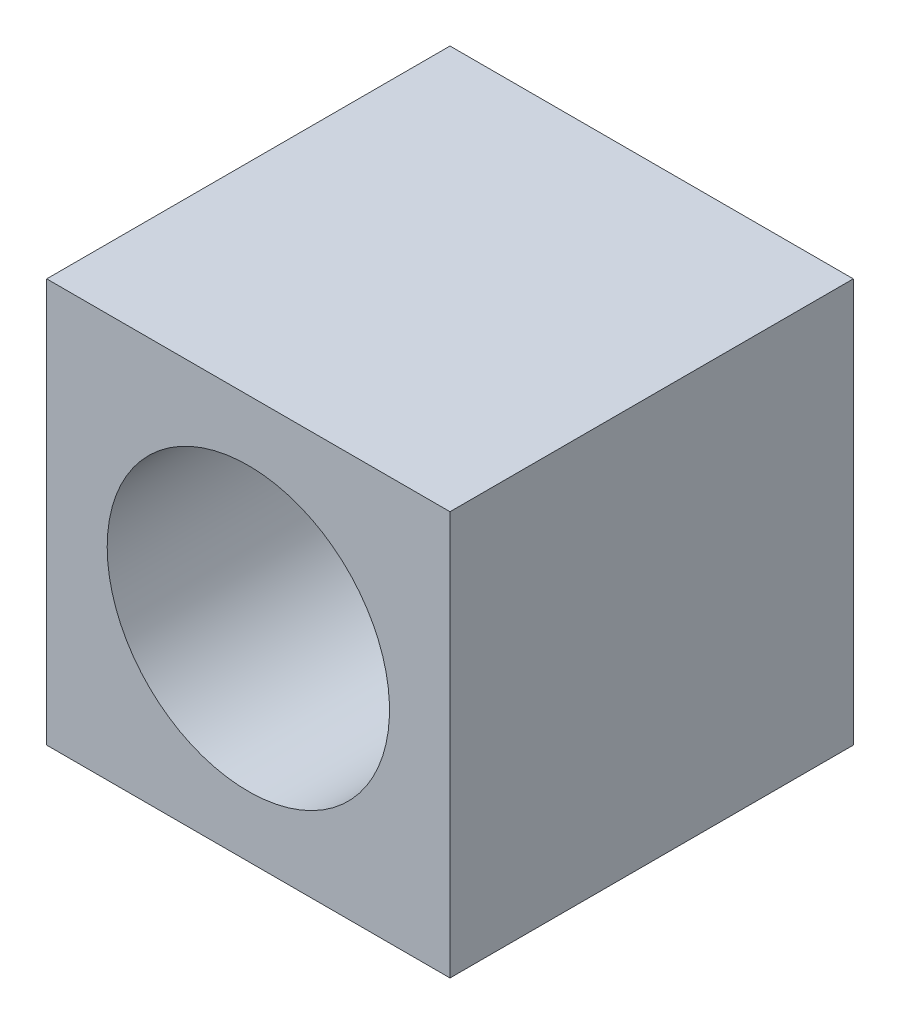
ISO-10303-21;
HEADER;
FILE_DESCRIPTION(('STEP AP214'),'2;1');
FILE_NAME('part.step','',(''),(''),'','','');
FILE_SCHEMA(('AUTOMOTIVE_DESIGN { 1 0 10303 214 1 1 1 1 }'));
ENDSEC;
DATA;
#1=APPLICATION_CONTEXT('core data for automotive mechanical design processes');
#2=APPLICATION_PROTOCOL_DEFINITION('international standard','automotive_design',2000,#1);
#3=PRODUCT_CONTEXT('',#1,'mechanical');
#4=PRODUCT('Part','Part','',(#3));
#5=PRODUCT_RELATED_PRODUCT_CATEGORY('part','',(#4));
#6=PRODUCT_DEFINITION_FORMATION('','',#4);
#7=PRODUCT_DEFINITION_CONTEXT('part definition',#1,'design');
#8=PRODUCT_DEFINITION('design','',#6,#7);
#9=PRODUCT_DEFINITION_SHAPE('','',#8);
#10=(LENGTH_UNIT() NAMED_UNIT(*) SI_UNIT(.MILLI.,.METRE.));
#11=(NAMED_UNIT(*) PLANE_ANGLE_UNIT() SI_UNIT($,.RADIAN.));
#12=(NAMED_UNIT(*) SI_UNIT($,.STERADIAN.) SOLID_ANGLE_UNIT());
#13=UNCERTAINTY_MEASURE_WITH_UNIT(LENGTH_MEASURE(1.E-05),#10,'distance_accuracy_value','');
#14=(GEOMETRIC_REPRESENTATION_CONTEXT(3) GLOBAL_UNCERTAINTY_ASSIGNED_CONTEXT((#13)) GLOBAL_UNIT_ASSIGNED_CONTEXT((#10,
#11,#12)) REPRESENTATION_CONTEXT('',''));
#15=CARTESIAN_POINT('',(0.,0.,0.));
#16=DIRECTION('',(0.,0.,1.));
#17=DIRECTION('',(1.,0.,0.));
#18=AXIS2_PLACEMENT_3D('',#15,#16,#17);
#19=CARTESIAN_POINT('',(19.05,19.0749941686788,38.1));
#20=DIRECTION('',(0.,0.,-1.));
#21=DIRECTION('',(-1.,0.,0.));
#22=AXIS2_PLACEMENT_3D('',#19,#20,#21);
#23=PLANE('',#22);
#24=DIRECTION('',(0.,1.,0.));
#25=VECTOR('',#24,1.);
#26=CARTESIAN_POINT('',(19.05,-19.0749941686788,38.1));
#27=LINE('',#26,#25);
#28=CARTESIAN_POINT('',(19.05,-19.0749941686788,38.1));
#29=VERTEX_POINT('',#28);
#30=CARTESIAN_POINT('',(19.05,19.0749941686788,38.1));
#31=VERTEX_POINT('',#30);
#32=EDGE_CURVE('E82',#29,#31,#27,.T.);
#33=ORIENTED_EDGE('',*,*,#32,.T.);
#34=DIRECTION('',(-1.,0.,0.));
#35=VECTOR('',#34,1.);
#36=CARTESIAN_POINT('',(-19.05,19.0749941686788,38.1));
#37=LINE('',#36,#35);
#38=CARTESIAN_POINT('',(-19.05,19.0749941686788,38.1));
#39=VERTEX_POINT('',#38);
#40=EDGE_CURVE('E77',#31,#39,#37,.T.);
#41=ORIENTED_EDGE('',*,*,#40,.T.);
#42=DIRECTION('',(0.,-1.,0.));
#43=VECTOR('',#42,1.);
#44=CARTESIAN_POINT('',(-19.05,-19.0749941686788,38.1));
#45=LINE('',#44,#43);
#46=CARTESIAN_POINT('',(-19.05,-19.0749941686788,38.1));
#47=VERTEX_POINT('',#46);
#48=EDGE_CURVE('E80',#39,#47,#45,.T.);
#49=ORIENTED_EDGE('',*,*,#48,.T.);
#50=DIRECTION('',(1.,0.,0.));
#51=VECTOR('',#50,1.);
#52=CARTESIAN_POINT('',(-19.05,-19.0749941686788,38.1));
#53=LINE('',#52,#51);
#54=EDGE_CURVE('E47',#47,#29,#53,.T.);
#55=ORIENTED_EDGE('',*,*,#54,.T.);
#56=EDGE_LOOP('',(#33,#41,#49,#55));
#57=FACE_BOUND('',#56,.T.);
#58=CARTESIAN_POINT('',(0.,0.,38.1));
#59=DIRECTION('',(0.,0.,1.));
#60=DIRECTION('',(1.,0.,0.));
#61=AXIS2_PLACEMENT_3D('',#58,#59,#60);
#62=CIRCLE('',#61,13.335);
#63=CARTESIAN_POINT('',(-13.335,0.,38.1));
#64=VERTEX_POINT('',#63);
#65=EDGE_CURVE('E97',#64,#64,#62,.T.);
#66=ORIENTED_EDGE('',*,*,#65,.F.);
#67=EDGE_LOOP('',(#66));
#68=FACE_BOUND('',#67,.T.);
#69=ADVANCED_FACE('F30',(#57,#68),#23,.F.);
#70=CARTESIAN_POINT('',(19.05,19.0749941686788,0.));
#71=DIRECTION('',(0.,0.,-1.));
#72=DIRECTION('',(-1.,0.,0.));
#73=AXIS2_PLACEMENT_3D('',#70,#71,#72);
#74=PLANE('',#73);
#75=DIRECTION('',(0.,1.,0.));
#76=VECTOR('',#75,1.);
#77=CARTESIAN_POINT('',(19.05,-19.0749941686788,0.));
#78=LINE('',#77,#76);
#79=CARTESIAN_POINT('',(19.05,-19.0749941686788,0.));
#80=VERTEX_POINT('',#79);
#81=CARTESIAN_POINT('',(19.05,19.0749941686788,0.));
#82=VERTEX_POINT('',#81);
#83=EDGE_CURVE('E94',#80,#82,#78,.T.);
#84=ORIENTED_EDGE('',*,*,#83,.F.);
#85=DIRECTION('',(1.,0.,0.));
#86=VECTOR('',#85,1.);
#87=CARTESIAN_POINT('',(-19.05,-19.0749941686788,0.));
#88=LINE('',#87,#86);
#89=CARTESIAN_POINT('',(-19.05,-19.0749941686788,0.));
#90=VERTEX_POINT('',#89);
#91=EDGE_CURVE('E70',#90,#80,#88,.T.);
#92=ORIENTED_EDGE('',*,*,#91,.F.);
#93=DIRECTION('',(0.,-1.,0.));
#94=VECTOR('',#93,1.);
#95=CARTESIAN_POINT('',(-19.05,-19.0749941686788,0.));
#96=LINE('',#95,#94);
#97=CARTESIAN_POINT('',(-19.05,19.0749941686788,0.));
#98=VERTEX_POINT('',#97);
#99=EDGE_CURVE('E64',#98,#90,#96,.T.);
#100=ORIENTED_EDGE('',*,*,#99,.F.);
#101=DIRECTION('',(-1.,0.,0.));
#102=VECTOR('',#101,1.);
#103=CARTESIAN_POINT('',(-19.05,19.0749941686788,0.));
#104=LINE('',#103,#102);
#105=EDGE_CURVE('E86',#82,#98,#104,.T.);
#106=ORIENTED_EDGE('',*,*,#105,.F.);
#107=EDGE_LOOP('',(#84,#92,#100,#106));
#108=FACE_BOUND('',#107,.T.);
#109=CARTESIAN_POINT('',(0.,0.,0.));
#110=DIRECTION('',(0.,0.,1.));
#111=DIRECTION('',(1.,0.,0.));
#112=AXIS2_PLACEMENT_3D('',#109,#110,#111);
#113=CIRCLE('',#112,13.335);
#114=CARTESIAN_POINT('',(-13.335,0.,0.));
#115=VERTEX_POINT('',#114);
#116=EDGE_CURVE('E109',#115,#115,#113,.T.);
#117=ORIENTED_EDGE('',*,*,#116,.T.);
#118=EDGE_LOOP('',(#117));
#119=FACE_BOUND('',#118,.T.);
#120=ADVANCED_FACE('F105',(#108,#119),#74,.T.);
#121=CARTESIAN_POINT('',(19.05,-19.0749941686788,38.1));
#122=DIRECTION('',(-1.,0.,0.));
#123=DIRECTION('',(0.,0.,1.));
#124=AXIS2_PLACEMENT_3D('',#121,#122,#123);
#125=PLANE('',#124);
#126=ORIENTED_EDGE('',*,*,#83,.T.);
#127=DIRECTION('',(0.,0.,-1.));
#128=VECTOR('',#127,1.);
#129=CARTESIAN_POINT('',(19.05,19.0749941686788,38.1));
#130=LINE('',#129,#128);
#131=EDGE_CURVE('E11',#31,#82,#130,.T.);
#132=ORIENTED_EDGE('',*,*,#131,.F.);
#133=ORIENTED_EDGE('',*,*,#32,.F.);
#134=DIRECTION('',(0.,0.,-1.));
#135=VECTOR('',#134,1.);
#136=CARTESIAN_POINT('',(19.05,-19.0749941686788,38.1));
#137=LINE('',#136,#135);
#138=EDGE_CURVE('E90',#29,#80,#137,.T.);
#139=ORIENTED_EDGE('',*,*,#138,.T.);
#140=EDGE_LOOP('',(#126,#132,#133,#139));
#141=FACE_BOUND('',#140,.T.);
#142=ADVANCED_FACE('F32',(#141),#125,.F.);
#143=CARTESIAN_POINT('',(-19.05,19.0749941686788,38.1));
#144=DIRECTION('',(0.,-1.,0.));
#145=DIRECTION('',(0.,0.,-1.));
#146=AXIS2_PLACEMENT_3D('',#143,#144,#145);
#147=PLANE('',#146);
#148=ORIENTED_EDGE('',*,*,#105,.T.);
#149=DIRECTION('',(0.,0.,-1.));
#150=VECTOR('',#149,1.);
#151=CARTESIAN_POINT('',(-19.05,19.0749941686788,38.1));
#152=LINE('',#151,#150);
#153=EDGE_CURVE('E39',#39,#98,#152,.T.);
#154=ORIENTED_EDGE('',*,*,#153,.F.);
#155=ORIENTED_EDGE('',*,*,#40,.F.);
#156=ORIENTED_EDGE('',*,*,#131,.T.);
#157=EDGE_LOOP('',(#148,#154,#155,#156));
#158=FACE_BOUND('',#157,.T.);
#159=ADVANCED_FACE('F85',(#158),#147,.F.);
#160=CARTESIAN_POINT('',(-19.05,-19.0749941686788,38.1));
#161=DIRECTION('',(1.,0.,0.));
#162=DIRECTION('',(0.,0.,-1.));
#163=AXIS2_PLACEMENT_3D('',#160,#161,#162);
#164=PLANE('',#163);
#165=ORIENTED_EDGE('',*,*,#99,.T.);
#166=DIRECTION('',(0.,0.,-1.));
#167=VECTOR('',#166,1.);
#168=CARTESIAN_POINT('',(-19.05,-19.0749941686788,38.1));
#169=LINE('',#168,#167);
#170=EDGE_CURVE('E87',#47,#90,#169,.T.);
#171=ORIENTED_EDGE('',*,*,#170,.F.);
#172=ORIENTED_EDGE('',*,*,#48,.F.);
#173=ORIENTED_EDGE('',*,*,#153,.T.);
#174=EDGE_LOOP('',(#165,#171,#172,#173));
#175=FACE_BOUND('',#174,.T.);
#176=ADVANCED_FACE('F88',(#175),#164,.F.);
#177=CARTESIAN_POINT('',(-19.05,-19.0749941686788,38.1));
#178=DIRECTION('',(0.,1.,0.));
#179=DIRECTION('',(0.,0.,1.));
#180=AXIS2_PLACEMENT_3D('',#177,#178,#179);
#181=PLANE('',#180);
#182=ORIENTED_EDGE('',*,*,#91,.T.);
#183=ORIENTED_EDGE('',*,*,#138,.F.);
#184=ORIENTED_EDGE('',*,*,#54,.F.);
#185=ORIENTED_EDGE('',*,*,#170,.T.);
#186=EDGE_LOOP('',(#182,#183,#184,#185));
#187=FACE_BOUND('',#186,.T.);
#188=ADVANCED_FACE('F102',(#187),#181,.F.);
#189=CARTESIAN_POINT('',(0.,0.,38.1));
#190=DIRECTION('',(0.,0.,-1.));
#191=DIRECTION('',(-1.,0.,0.));
#192=AXIS2_PLACEMENT_3D('',#189,#190,#191);
#193=CYLINDRICAL_SURFACE('',#192,13.335);
#194=CARTESIAN_POINT('',(-13.335,0.,38.1));
#195=CARTESIAN_POINT('',(-13.335,0.,37.703125));
#196=CARTESIAN_POINT('',(-13.335,0.,37.30625));
#197=CARTESIAN_POINT('',(-13.335,0.,36.5125));
#198=CARTESIAN_POINT('',(-13.335,0.,36.115625));
#199=CARTESIAN_POINT('',(-13.335,0.,35.321875));
#200=CARTESIAN_POINT('',(-13.335,0.,34.925));
#201=CARTESIAN_POINT('',(-13.335,0.,34.13125));
#202=CARTESIAN_POINT('',(-13.335,0.,33.734375));
#203=CARTESIAN_POINT('',(-13.335,0.,32.940625));
#204=CARTESIAN_POINT('',(-13.335,0.,32.54375));
#205=CARTESIAN_POINT('',(-13.335,0.,31.75));
#206=CARTESIAN_POINT('',(-13.335,0.,31.353125));
#207=CARTESIAN_POINT('',(-13.335,0.,30.559375));
#208=CARTESIAN_POINT('',(-13.335,0.,30.1625));
#209=CARTESIAN_POINT('',(-13.335,0.,29.36875));
#210=CARTESIAN_POINT('',(-13.335,0.,28.971875));
#211=CARTESIAN_POINT('',(-13.335,0.,28.178125));
#212=CARTESIAN_POINT('',(-13.335,0.,27.78125));
#213=CARTESIAN_POINT('',(-13.335,0.,26.9875));
#214=CARTESIAN_POINT('',(-13.335,0.,26.590625));
#215=CARTESIAN_POINT('',(-13.335,0.,25.796875));
#216=CARTESIAN_POINT('',(-13.335,0.,25.4));
#217=CARTESIAN_POINT('',(-13.335,0.,24.60625));
#218=CARTESIAN_POINT('',(-13.335,0.,24.209375));
#219=CARTESIAN_POINT('',(-13.335,0.,23.415625));
#220=CARTESIAN_POINT('',(-13.335,0.,23.01875));
#221=CARTESIAN_POINT('',(-13.335,0.,22.225));
#222=CARTESIAN_POINT('',(-13.335,0.,21.828125));
#223=CARTESIAN_POINT('',(-13.335,0.,21.034375));
#224=CARTESIAN_POINT('',(-13.335,0.,20.6375));
#225=CARTESIAN_POINT('',(-13.335,0.,19.84375));
#226=CARTESIAN_POINT('',(-13.335,0.,19.446875));
#227=CARTESIAN_POINT('',(-13.335,0.,18.653125));
#228=CARTESIAN_POINT('',(-13.335,0.,18.25625));
#229=CARTESIAN_POINT('',(-13.335,0.,17.4625));
#230=CARTESIAN_POINT('',(-13.335,0.,17.065625));
#231=CARTESIAN_POINT('',(-13.335,0.,16.271875));
#232=CARTESIAN_POINT('',(-13.335,0.,15.875));
#233=CARTESIAN_POINT('',(-13.335,0.,15.08125));
#234=CARTESIAN_POINT('',(-13.335,0.,14.684375));
#235=CARTESIAN_POINT('',(-13.335,0.,13.890625));
#236=CARTESIAN_POINT('',(-13.335,0.,13.49375));
#237=CARTESIAN_POINT('',(-13.335,0.,12.7));
#238=CARTESIAN_POINT('',(-13.335,0.,12.303125));
#239=CARTESIAN_POINT('',(-13.335,0.,11.509375));
#240=CARTESIAN_POINT('',(-13.335,0.,11.1125));
#241=CARTESIAN_POINT('',(-13.335,0.,10.31875));
#242=CARTESIAN_POINT('',(-13.335,0.,9.92187499999999));
#243=CARTESIAN_POINT('',(-13.335,0.,9.128125));
#244=CARTESIAN_POINT('',(-13.335,0.,8.73124999999999));
#245=CARTESIAN_POINT('',(-13.335,0.,7.93749999999999));
#246=CARTESIAN_POINT('',(-13.335,0.,7.54062499999999));
#247=CARTESIAN_POINT('',(-13.335,0.,6.746875));
#248=CARTESIAN_POINT('',(-13.335,0.,6.35));
#249=CARTESIAN_POINT('',(-13.335,0.,5.55625));
#250=CARTESIAN_POINT('',(-13.335,0.,5.159375));
#251=CARTESIAN_POINT('',(-13.335,0.,4.365625));
#252=CARTESIAN_POINT('',(-13.335,0.,3.96875));
#253=CARTESIAN_POINT('',(-13.335,0.,3.175));
#254=CARTESIAN_POINT('',(-13.335,0.,2.778125));
#255=CARTESIAN_POINT('',(-13.335,0.,1.984375));
#256=CARTESIAN_POINT('',(-13.335,0.,1.5875));
#257=CARTESIAN_POINT('',(-13.335,0.,0.79375));
#258=CARTESIAN_POINT('',(-13.335,0.,0.396875));
#259=CARTESIAN_POINT('',(-13.335,0.,0.));
#260=B_SPLINE_CURVE_WITH_KNOTS('',3,(#194,#195,#196,#197,#198,#199,#200,#201,#202,#203,#204,
#205,#206,#207,#208,#209,#210,#211,#212,#213,#214,#215,#216,#217,#218,#219,#220,#221,#222,#223,
#224,#225,#226,#227,#228,#229,#230,#231,#232,#233,#234,#235,#236,#237,#238,#239,#240,#241,#242,
#243,#244,#245,#246,#247,#248,#249,#250,#251,#252,#253,#254,#255,#256,#257,#258,#259),
.UNSPECIFIED.,.F.,.F.,(4,2,2,2,2,2,2,2,2,2,2,2,2,2,2,2,2,2,2,2,2,2,2,2,2,2,2,2,2,2,2,2,4),(0.,
1.190625,2.38125,3.571875,4.7625,5.953125,7.14375,8.334375,9.52500000000001,10.715625,11.90625,
13.096875,14.2875,15.478125,16.66875,17.859375,19.05,20.240625,21.43125,22.621875,23.8125,
25.003125,26.19375,27.384375,28.575,29.765625,30.95625,32.146875,33.3375,34.528125,35.71875,
36.909375,38.1),.UNSPECIFIED.);
#261=EDGE_CURVE('BSEAM115',#64,#115,#260,.T.);
#262=ORIENTED_EDGE('',*,*,#65,.T.);
#263=ORIENTED_EDGE('',*,*,#116,.F.);
#264=ORIENTED_EDGE('',*,*,#261,.T.);
#265=ORIENTED_EDGE('',*,*,#261,.F.);
#266=EDGE_LOOP('',(#262,#264,#263,#265));
#267=FACE_BOUND('',#266,.T.);
#268=ADVANCED_FACE('F115',(#267),#193,.F.);
#269=CLOSED_SHELL('',(#69,#120,#142,#159,#176,#188,#268));
#270=MANIFOLD_SOLID_BREP('B2',#269);
#271=ADVANCED_BREP_SHAPE_REPRESENTATION('',(#18,#270),#14);
#272=SHAPE_DEFINITION_REPRESENTATION(#9,#271);
ENDSEC;
END-ISO-10303-21;
